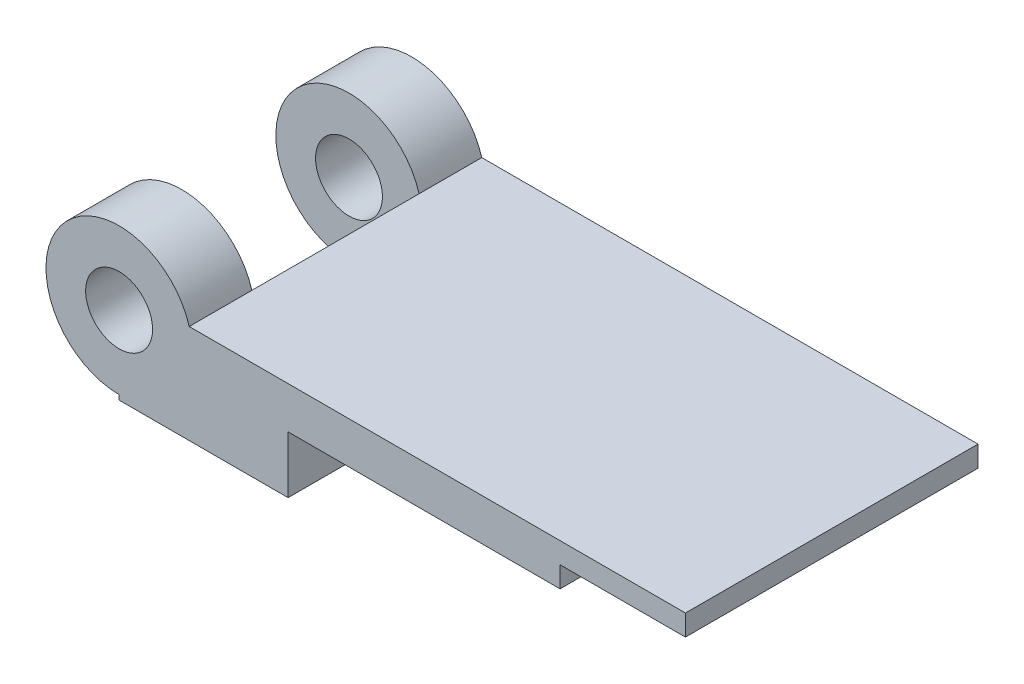
ISO-10303-21;
HEADER;
FILE_DESCRIPTION(('STEP AP214'),'2;1');
FILE_NAME('part.step','',(''),(''),'','','');
FILE_SCHEMA(('AUTOMOTIVE_DESIGN { 1 0 10303 214 1 1 1 1 }'));
ENDSEC;
DATA;
#1=APPLICATION_CONTEXT('core data for automotive mechanical design processes');
#2=APPLICATION_PROTOCOL_DEFINITION('international standard','automotive_design',2000,#1);
#3=PRODUCT_CONTEXT('',#1,'mechanical');
#4=PRODUCT('Part','Part','',(#3));
#5=PRODUCT_RELATED_PRODUCT_CATEGORY('part','',(#4));
#6=PRODUCT_DEFINITION_FORMATION('','',#4);
#7=PRODUCT_DEFINITION_CONTEXT('part definition',#1,'design');
#8=PRODUCT_DEFINITION('design','',#6,#7);
#9=PRODUCT_DEFINITION_SHAPE('','',#8);
#10=(LENGTH_UNIT() NAMED_UNIT(*) SI_UNIT(.MILLI.,.METRE.));
#11=(NAMED_UNIT(*) PLANE_ANGLE_UNIT() SI_UNIT($,.RADIAN.));
#12=(NAMED_UNIT(*) SI_UNIT($,.STERADIAN.) SOLID_ANGLE_UNIT());
#13=UNCERTAINTY_MEASURE_WITH_UNIT(LENGTH_MEASURE(1.E-05),#10,'distance_accuracy_value','');
#14=(GEOMETRIC_REPRESENTATION_CONTEXT(3) GLOBAL_UNCERTAINTY_ASSIGNED_CONTEXT((#13)) GLOBAL_UNIT_ASSIGNED_CONTEXT((#10,
#11,#12)) REPRESENTATION_CONTEXT('',''));
#15=CARTESIAN_POINT('',(0.,0.,0.));
#16=DIRECTION('',(0.,0.,1.));
#17=DIRECTION('',(1.,0.,0.));
#18=AXIS2_PLACEMENT_3D('',#15,#16,#17);
#19=CARTESIAN_POINT('',(0.,0.,3.));
#20=DIRECTION('',(0.,0.,1.));
#21=DIRECTION('',(1.,0.,0.));
#22=AXIS2_PLACEMENT_3D('',#19,#20,#21);
#23=CYLINDRICAL_SURFACE('',#22,3.5);
#24=CARTESIAN_POINT('',(0.,0.,11.));
#25=DIRECTION('',(0.,0.,1.));
#26=DIRECTION('',(1.,0.,0.));
#27=AXIS2_PLACEMENT_3D('',#24,#25,#26);
#28=CIRCLE('',#27,3.5);
#29=CARTESIAN_POINT('',(0.,-3.5,11.));
#30=VERTEX_POINT('',#29);
#31=CARTESIAN_POINT('',(1.01365674663567,-3.35,11.));
#32=VERTEX_POINT('',#31);
#33=EDGE_CURVE('E223',#30,#32,#28,.T.);
#34=ORIENTED_EDGE('',*,*,#33,.T.);
#35=DIRECTION('',(0.,0.,1.));
#36=VECTOR('',#35,1.);
#37=CARTESIAN_POINT('',(1.01365674663567,-3.35,3.));
#38=LINE('',#37,#36);
#39=CARTESIAN_POINT('',(1.01365674663567,-3.35,3.));
#40=VERTEX_POINT('',#39);
#41=EDGE_CURVE('E177',#32,#40,#38,.F.);
#42=ORIENTED_EDGE('',*,*,#41,.T.);
#43=CARTESIAN_POINT('',(0.,0.,3.));
#44=DIRECTION('',(0.,0.,1.));
#45=DIRECTION('',(1.,0.,0.));
#46=AXIS2_PLACEMENT_3D('',#43,#44,#45);
#47=CIRCLE('',#46,3.5);
#48=CARTESIAN_POINT('',(0.,-3.5,3.));
#49=VERTEX_POINT('',#48);
#50=EDGE_CURVE('E218',#49,#40,#47,.T.);
#51=ORIENTED_EDGE('',*,*,#50,.F.);
#52=DIRECTION('',(0.,0.,1.));
#53=VECTOR('',#52,1.);
#54=CARTESIAN_POINT('',(0.,-3.5,-8.53336630915363));
#55=LINE('',#54,#53);
#56=EDGE_CURVE('E208',#49,#30,#55,.T.);
#57=ORIENTED_EDGE('',*,*,#56,.T.);
#58=EDGE_LOOP('',(#34,#42,#51,#57));
#59=FACE_BOUND('',#58,.T.);
#60=ADVANCED_FACE('F39',(#59),#23,.F.);
#61=CARTESIAN_POINT('',(8.08554437461576,-2.1,-8.53336630915363));
#62=DIRECTION('',(1.,0.,0.));
#63=DIRECTION('',(0.,0.,-1.));
#64=AXIS2_PLACEMENT_3D('',#61,#62,#63);
#65=PLANE('',#64);
#66=DIRECTION('',(0.,-1.,0.));
#67=VECTOR('',#66,1.);
#68=CARTESIAN_POINT('',(8.08554437461576,-2.1,0.));
#69=LINE('',#68,#67);
#70=CARTESIAN_POINT('',(8.08554437461576,-1.,0.));
#71=VERTEX_POINT('',#70);
#72=CARTESIAN_POINT('',(8.08554437461576,-3.72806025085915,0.));
#73=VERTEX_POINT('',#72);
#74=EDGE_CURVE('E187',#71,#73,#69,.T.);
#75=ORIENTED_EDGE('',*,*,#74,.F.);
#76=DIRECTION('',(0.,0.,1.));
#77=VECTOR('',#76,1.);
#78=CARTESIAN_POINT('',(8.08554437461576,-1.,-8.53336630915363));
#79=LINE('',#78,#77);
#80=CARTESIAN_POINT('',(8.08554437461576,-1.,14.));
#81=VERTEX_POINT('',#80);
#82=EDGE_CURVE('E185',#71,#81,#79,.T.);
#83=ORIENTED_EDGE('',*,*,#82,.T.);
#84=DIRECTION('',(0.,1.,0.));
#85=VECTOR('',#84,1.);
#86=CARTESIAN_POINT('',(8.08554437461576,-2.1,14.));
#87=LINE('',#86,#85);
#88=CARTESIAN_POINT('',(8.08554437461576,-3.72806025085915,14.));
#89=VERTEX_POINT('',#88);
#90=EDGE_CURVE('E195',#89,#81,#87,.T.);
#91=ORIENTED_EDGE('',*,*,#90,.F.);
#92=DIRECTION('',(0.,0.,1.));
#93=VECTOR('',#92,1.);
#94=CARTESIAN_POINT('',(8.08554437461576,-3.72806025085915,-8.53336630915363));
#95=LINE('',#94,#93);
#96=EDGE_CURVE('E201',#73,#89,#95,.T.);
#97=ORIENTED_EDGE('',*,*,#96,.F.);
#98=EDGE_LOOP('',(#75,#83,#91,#97));
#99=FACE_BOUND('',#98,.T.);
#100=DIRECTION('',(0.,0.,1.));
#101=VECTOR('',#100,1.);
#102=CARTESIAN_POINT('',(8.08554437461576,-3.35,-4.51758122903492));
#103=LINE('',#102,#101);
#104=CARTESIAN_POINT('',(8.08554437461576,-3.35,3.));
#105=VERTEX_POINT('',#104);
#106=CARTESIAN_POINT('',(8.08554437461576,-3.35,11.));
#107=VERTEX_POINT('',#106);
#108=EDGE_CURVE('E62',#105,#107,#103,.T.);
#109=ORIENTED_EDGE('',*,*,#108,.T.);
#110=DIRECTION('',(0.,1.,0.));
#111=VECTOR('',#110,1.);
#112=CARTESIAN_POINT('',(8.08554437461576,-2.15,11.));
#113=LINE('',#112,#111);
#114=CARTESIAN_POINT('',(8.08554437461576,-2.15,11.));
#115=VERTEX_POINT('',#114);
#116=EDGE_CURVE('E161',#107,#115,#113,.T.);
#117=ORIENTED_EDGE('',*,*,#116,.T.);
#118=DIRECTION('',(0.,0.,1.));
#119=VECTOR('',#118,1.);
#120=CARTESIAN_POINT('',(8.08554437461576,-2.15,-4.51758122903492));
#121=LINE('',#120,#119);
#122=CARTESIAN_POINT('',(8.08554437461576,-2.15,3.));
#123=VERTEX_POINT('',#122);
#124=EDGE_CURVE('E145',#123,#115,#121,.T.);
#125=ORIENTED_EDGE('',*,*,#124,.F.);
#126=DIRECTION('',(0.,-1.,0.));
#127=VECTOR('',#126,1.);
#128=CARTESIAN_POINT('',(8.08554437461576,-2.15,3.));
#129=LINE('',#128,#127);
#130=EDGE_CURVE('E168',#123,#105,#129,.T.);
#131=ORIENTED_EDGE('',*,*,#130,.T.);
#132=EDGE_LOOP('',(#109,#117,#125,#131));
#133=FACE_BOUND('',#132,.T.);
#134=ADVANCED_FACE('F165',(#99,#133),#65,.T.);
#135=CARTESIAN_POINT('',(0.,0.,14.));
#136=DIRECTION('',(0.,0.,-1.));
#137=DIRECTION('',(-1.,0.,0.));
#138=AXIS2_PLACEMENT_3D('',#135,#136,#137);
#139=CYLINDRICAL_SURFACE('',#138,3.5);
#140=CARTESIAN_POINT('',(0.,0.,0.));
#141=DIRECTION('',(0.,0.,1.));
#142=DIRECTION('',(1.,0.,0.));
#143=AXIS2_PLACEMENT_3D('',#140,#141,#142);
#144=CIRCLE('',#143,3.5);
#145=CARTESIAN_POINT('',(3.35410196624968,1.,0.));
#146=VERTEX_POINT('',#145);
#147=CARTESIAN_POINT('',(0.,-3.5,0.));
#148=VERTEX_POINT('',#147);
#149=EDGE_CURVE('E246',#146,#148,#144,.T.);
#150=ORIENTED_EDGE('',*,*,#149,.T.);
#151=EDGE_CURVE('E205',#148,#49,#55,.T.);
#152=ORIENTED_EDGE('',*,*,#151,.T.);
#153=CARTESIAN_POINT('',(3.35410196624968,1.,3.));
#154=VERTEX_POINT('',#153);
#155=EDGE_CURVE('E214',#154,#49,#47,.T.);
#156=ORIENTED_EDGE('',*,*,#155,.F.);
#157=DIRECTION('',(0.,0.,-1.));
#158=VECTOR('',#157,1.);
#159=CARTESIAN_POINT('',(3.35410196624968,1.,14.));
#160=LINE('',#159,#158);
#161=EDGE_CURVE('E259',#154,#146,#160,.T.);
#162=ORIENTED_EDGE('',*,*,#161,.T.);
#163=EDGE_LOOP('',(#150,#152,#156,#162));
#164=FACE_BOUND('',#163,.T.);
#165=ADVANCED_FACE('F275',(#164),#139,.T.);
#166=CARTESIAN_POINT('',(0.,0.,14.));
#167=DIRECTION('',(0.,0.,-1.));
#168=DIRECTION('',(-1.,0.,0.));
#169=AXIS2_PLACEMENT_3D('',#166,#167,#168);
#170=CYLINDRICAL_SURFACE('',#169,1.6);
#171=CARTESIAN_POINT('',(0.,0.,0.));
#172=DIRECTION('',(0.,0.,1.));
#173=DIRECTION('',(1.,0.,0.));
#174=AXIS2_PLACEMENT_3D('',#171,#172,#173);
#175=CIRCLE('',#174,1.6);
#176=CARTESIAN_POINT('',(1.6,0.,0.));
#177=VERTEX_POINT('',#176);
#178=EDGE_CURVE('E239',#177,#177,#175,.T.);
#179=ORIENTED_EDGE('',*,*,#178,.F.);
#180=EDGE_LOOP('',(#179));
#181=FACE_BOUND('',#180,.T.);
#182=CARTESIAN_POINT('',(0.,0.,3.));
#183=DIRECTION('',(0.,0.,1.));
#184=DIRECTION('',(1.,0.,0.));
#185=AXIS2_PLACEMENT_3D('',#182,#183,#184);
#186=CIRCLE('',#185,1.6);
#187=CARTESIAN_POINT('',(1.6,0.,3.));
#188=VERTEX_POINT('',#187);
#189=EDGE_CURVE('E209',#188,#188,#186,.T.);
#190=ORIENTED_EDGE('',*,*,#189,.T.);
#191=EDGE_LOOP('',(#190));
#192=FACE_BOUND('',#191,.T.);
#193=ADVANCED_FACE('F419',(#181,#192),#170,.F.);
#194=CARTESIAN_POINT('',(0.,0.,14.));
#195=DIRECTION('',(0.,0.,1.));
#196=DIRECTION('',(1.,0.,0.));
#197=AXIS2_PLACEMENT_3D('',#194,#195,#196);
#198=PLANE('',#197);
#199=CARTESIAN_POINT('',(0.,0.,14.));
#200=DIRECTION('',(0.,0.,1.));
#201=DIRECTION('',(1.,0.,0.));
#202=AXIS2_PLACEMENT_3D('',#199,#200,#201);
#203=CIRCLE('',#202,3.5);
#204=CARTESIAN_POINT('',(3.35410196624968,1.,14.));
#205=VERTEX_POINT('',#204);
#206=CARTESIAN_POINT('',(0.,-3.5,14.));
#207=VERTEX_POINT('',#206);
#208=EDGE_CURVE('E249',#205,#207,#203,.T.);
#209=ORIENTED_EDGE('',*,*,#208,.T.);
#210=DIRECTION('',(-1.60749424416334E-13,-1.,0.));
#211=VECTOR('',#210,1.);
#212=CARTESIAN_POINT('',(0.,-3.5,14.));
#213=LINE('',#212,#211);
#214=CARTESIAN_POINT('',(0.,-3.72806025085915,14.));
#215=VERTEX_POINT('',#214);
#216=EDGE_CURVE('E180',#207,#215,#213,.T.);
#217=ORIENTED_EDGE('',*,*,#216,.T.);
#218=DIRECTION('',(1.,0.,0.));
#219=VECTOR('',#218,1.);
#220=CARTESIAN_POINT('',(0.,-3.72806025085915,14.));
#221=LINE('',#220,#219);
#222=EDGE_CURVE('E192',#215,#89,#221,.T.);
#223=ORIENTED_EDGE('',*,*,#222,.T.);
#224=ORIENTED_EDGE('',*,*,#90,.T.);
#225=DIRECTION('',(1.,0.,0.));
#226=VECTOR('',#225,1.);
#227=CARTESIAN_POINT('',(3.35410196624968,-1.,14.));
#228=LINE('',#227,#226);
#229=CARTESIAN_POINT('',(21.1,-1.,14.));
#230=VERTEX_POINT('',#229);
#231=EDGE_CURVE('E252',#81,#230,#228,.T.);
#232=ORIENTED_EDGE('',*,*,#231,.T.);
#233=DIRECTION('',(0.,-1.,0.));
#234=VECTOR('',#233,1.);
#235=CARTESIAN_POINT('',(21.1,0.,14.));
#236=LINE('',#235,#234);
#237=CARTESIAN_POINT('',(21.1,0.,14.));
#238=VERTEX_POINT('',#237);
#239=EDGE_CURVE('E228',#238,#230,#236,.T.);
#240=ORIENTED_EDGE('',*,*,#239,.F.);
#241=DIRECTION('',(-1.,0.,0.));
#242=VECTOR('',#241,1.);
#243=CARTESIAN_POINT('',(27.1,0.,14.));
#244=LINE('',#243,#242);
#245=CARTESIAN_POINT('',(27.1,0.,14.));
#246=VERTEX_POINT('',#245);
#247=EDGE_CURVE('E217',#246,#238,#244,.T.);
#248=ORIENTED_EDGE('',*,*,#247,.F.);
#249=DIRECTION('',(0.,1.,0.));
#250=VECTOR('',#249,1.);
#251=CARTESIAN_POINT('',(27.1,1.,14.));
#252=LINE('',#251,#250);
#253=CARTESIAN_POINT('',(27.1,1.,14.));
#254=VERTEX_POINT('',#253);
#255=EDGE_CURVE('E255',#246,#254,#252,.T.);
#256=ORIENTED_EDGE('',*,*,#255,.T.);
#257=DIRECTION('',(-1.,0.,0.));
#258=VECTOR('',#257,1.);
#259=CARTESIAN_POINT('',(3.35410196624968,1.,14.));
#260=LINE('',#259,#258);
#261=EDGE_CURVE('E257',#254,#205,#260,.T.);
#262=ORIENTED_EDGE('',*,*,#261,.T.);
#263=EDGE_LOOP('',(#209,#217,#223,#224,#232,#240,#248,#256,#262));
#264=FACE_BOUND('',#263,.T.);
#265=CARTESIAN_POINT('',(0.,0.,14.));
#266=DIRECTION('',(0.,0.,1.));
#267=DIRECTION('',(1.,0.,0.));
#268=AXIS2_PLACEMENT_3D('',#265,#266,#267);
#269=CIRCLE('',#268,1.6);
#270=CARTESIAN_POINT('',(1.6,0.,14.));
#271=VERTEX_POINT('',#270);
#272=EDGE_CURVE('E243',#271,#271,#269,.T.);
#273=ORIENTED_EDGE('',*,*,#272,.F.);
#274=EDGE_LOOP('',(#273));
#275=FACE_BOUND('',#274,.T.);
#276=ADVANCED_FACE('F304',(#264,#275),#198,.T.);
#277=CARTESIAN_POINT('',(0.,0.,0.));
#278=DIRECTION('',(0.,0.,1.));
#279=DIRECTION('',(1.,0.,0.));
#280=AXIS2_PLACEMENT_3D('',#277,#278,#279);
#281=PLANE('',#280);
#282=DIRECTION('',(-1.,0.,0.));
#283=VECTOR('',#282,1.);
#284=CARTESIAN_POINT('',(27.1,0.,0.));
#285=LINE('',#284,#283);
#286=CARTESIAN_POINT('',(27.1,0.,0.));
#287=VERTEX_POINT('',#286);
#288=CARTESIAN_POINT('',(21.1,0.,0.));
#289=VERTEX_POINT('',#288);
#290=EDGE_CURVE('E224',#287,#289,#285,.T.);
#291=ORIENTED_EDGE('',*,*,#290,.T.);
#292=DIRECTION('',(0.,-1.,0.));
#293=VECTOR('',#292,1.);
#294=CARTESIAN_POINT('',(21.1,0.,0.));
#295=LINE('',#294,#293);
#296=CARTESIAN_POINT('',(21.1,-1.,0.));
#297=VERTEX_POINT('',#296);
#298=EDGE_CURVE('E227',#289,#297,#295,.T.);
#299=ORIENTED_EDGE('',*,*,#298,.T.);
#300=DIRECTION('',(1.,0.,0.));
#301=VECTOR('',#300,1.);
#302=CARTESIAN_POINT('',(3.35410196624968,-1.,0.));
#303=LINE('',#302,#301);
#304=EDGE_CURVE('E261',#71,#297,#303,.T.);
#305=ORIENTED_EDGE('',*,*,#304,.F.);
#306=ORIENTED_EDGE('',*,*,#74,.T.);
#307=DIRECTION('',(-1.,0.,0.));
#308=VECTOR('',#307,1.);
#309=CARTESIAN_POINT('',(0.,-3.72806025085915,0.));
#310=LINE('',#309,#308);
#311=CARTESIAN_POINT('',(0.,-3.72806025085915,0.));
#312=VERTEX_POINT('',#311);
#313=EDGE_CURVE('E184',#73,#312,#310,.T.);
#314=ORIENTED_EDGE('',*,*,#313,.T.);
#315=DIRECTION('',(1.60749424416334E-13,1.,0.));
#316=VECTOR('',#315,1.);
#317=CARTESIAN_POINT('',(0.,-3.5,0.));
#318=LINE('',#317,#316);
#319=EDGE_CURVE('E181',#312,#148,#318,.T.);
#320=ORIENTED_EDGE('',*,*,#319,.T.);
#321=ORIENTED_EDGE('',*,*,#149,.F.);
#322=DIRECTION('',(-1.,0.,0.));
#323=VECTOR('',#322,1.);
#324=CARTESIAN_POINT('',(3.35410196624968,1.,0.));
#325=LINE('',#324,#323);
#326=CARTESIAN_POINT('',(27.1,1.,0.));
#327=VERTEX_POINT('',#326);
#328=EDGE_CURVE('E253',#327,#146,#325,.T.);
#329=ORIENTED_EDGE('',*,*,#328,.F.);
#330=DIRECTION('',(0.,1.,0.));
#331=VECTOR('',#330,1.);
#332=CARTESIAN_POINT('',(27.1,1.,0.));
#333=LINE('',#332,#331);
#334=EDGE_CURVE('E263',#287,#327,#333,.T.);
#335=ORIENTED_EDGE('',*,*,#334,.F.);
#336=EDGE_LOOP('',(#291,#299,#305,#306,#314,#320,#321,#329,#335));
#337=FACE_BOUND('',#336,.T.);
#338=ORIENTED_EDGE('',*,*,#178,.T.);
#339=EDGE_LOOP('',(#338));
#340=FACE_BOUND('',#339,.T.);
#341=ADVANCED_FACE('F285',(#337,#340),#281,.F.);
#342=CARTESIAN_POINT('',(3.35410196624968,1.,11.));
#343=VERTEX_POINT('',#342);
#344=EDGE_CURVE('E220',#343,#30,#28,.T.);
#345=ORIENTED_EDGE('',*,*,#344,.T.);
#346=EDGE_CURVE('E198',#30,#207,#55,.T.);
#347=ORIENTED_EDGE('',*,*,#346,.T.);
#348=ORIENTED_EDGE('',*,*,#208,.F.);
#349=EDGE_CURVE('E47',#205,#343,#160,.T.);
#350=ORIENTED_EDGE('',*,*,#349,.T.);
#351=EDGE_LOOP('',(#345,#347,#348,#350));
#352=FACE_BOUND('',#351,.T.);
#353=ADVANCED_FACE('F41',(#352),#139,.T.);
#354=CARTESIAN_POINT('',(3.35410196624968,-1.,14.));
#355=DIRECTION('',(0.,1.,0.));
#356=DIRECTION('',(0.,0.,1.));
#357=AXIS2_PLACEMENT_3D('',#354,#355,#356);
#358=PLANE('',#357);
#359=ORIENTED_EDGE('',*,*,#231,.F.);
#360=ORIENTED_EDGE('',*,*,#82,.F.);
#361=ORIENTED_EDGE('',*,*,#304,.T.);
#362=DIRECTION('',(0.,0.,1.));
#363=VECTOR('',#362,1.);
#364=CARTESIAN_POINT('',(21.1,-1.,0.));
#365=LINE('',#364,#363);
#366=EDGE_CURVE('E236',#297,#230,#365,.T.);
#367=ORIENTED_EDGE('',*,*,#366,.T.);
#368=EDGE_LOOP('',(#359,#360,#361,#367));
#369=FACE_BOUND('',#368,.T.);
#370=ADVANCED_FACE('F316',(#369),#358,.F.);
#371=CARTESIAN_POINT('',(27.1,1.,14.));
#372=DIRECTION('',(-1.,0.,0.));
#373=DIRECTION('',(0.,0.,1.));
#374=AXIS2_PLACEMENT_3D('',#371,#372,#373);
#375=PLANE('',#374);
#376=ORIENTED_EDGE('',*,*,#255,.F.);
#377=DIRECTION('',(0.,0.,1.));
#378=VECTOR('',#377,1.);
#379=CARTESIAN_POINT('',(27.1,0.,0.));
#380=LINE('',#379,#378);
#381=EDGE_CURVE('E231',#287,#246,#380,.T.);
#382=ORIENTED_EDGE('',*,*,#381,.F.);
#383=ORIENTED_EDGE('',*,*,#334,.T.);
#384=DIRECTION('',(0.,0.,-1.));
#385=VECTOR('',#384,1.);
#386=CARTESIAN_POINT('',(27.1,1.,14.));
#387=LINE('',#386,#385);
#388=EDGE_CURVE('E11',#254,#327,#387,.T.);
#389=ORIENTED_EDGE('',*,*,#388,.F.);
#390=EDGE_LOOP('',(#376,#382,#383,#389));
#391=FACE_BOUND('',#390,.T.);
#392=ADVANCED_FACE('F326',(#391),#375,.F.);
#393=CARTESIAN_POINT('',(3.35410196624968,1.,14.));
#394=DIRECTION('',(0.,-1.,0.));
#395=DIRECTION('',(0.,0.,-1.));
#396=AXIS2_PLACEMENT_3D('',#393,#394,#395);
#397=PLANE('',#396);
#398=ORIENTED_EDGE('',*,*,#328,.T.);
#399=ORIENTED_EDGE('',*,*,#161,.F.);
#400=EDGE_CURVE('E267',#343,#154,#160,.T.);
#401=ORIENTED_EDGE('',*,*,#400,.F.);
#402=ORIENTED_EDGE('',*,*,#349,.F.);
#403=ORIENTED_EDGE('',*,*,#261,.F.);
#404=ORIENTED_EDGE('',*,*,#388,.T.);
#405=EDGE_LOOP('',(#398,#399,#401,#402,#403,#404));
#406=FACE_BOUND('',#405,.T.);
#407=ADVANCED_FACE('F280',(#406),#397,.F.);
#408=CARTESIAN_POINT('',(0.,0.,11.));
#409=DIRECTION('',(0.,0.,1.));
#410=DIRECTION('',(1.,0.,0.));
#411=AXIS2_PLACEMENT_3D('',#408,#409,#410);
#412=CIRCLE('',#411,1.6);
#413=CARTESIAN_POINT('',(1.6,0.,11.));
#414=VERTEX_POINT('',#413);
#415=EDGE_CURVE('E189',#414,#414,#412,.T.);
#416=ORIENTED_EDGE('',*,*,#415,.F.);
#417=EDGE_LOOP('',(#416));
#418=FACE_BOUND('',#417,.T.);
#419=ORIENTED_EDGE('',*,*,#272,.T.);
#420=EDGE_LOOP('',(#419));
#421=FACE_BOUND('',#420,.T.);
#422=ADVANCED_FACE('F336',(#418,#421),#170,.F.);
#423=CARTESIAN_POINT('',(21.1,0.,0.));
#424=DIRECTION('',(-1.,0.,0.));
#425=DIRECTION('',(0.,0.,1.));
#426=AXIS2_PLACEMENT_3D('',#423,#424,#425);
#427=PLANE('',#426);
#428=ORIENTED_EDGE('',*,*,#239,.T.);
#429=ORIENTED_EDGE('',*,*,#366,.F.);
#430=ORIENTED_EDGE('',*,*,#298,.F.);
#431=DIRECTION('',(0.,0.,1.));
#432=VECTOR('',#431,1.);
#433=CARTESIAN_POINT('',(21.1,0.,0.));
#434=LINE('',#433,#432);
#435=EDGE_CURVE('E240',#289,#238,#434,.T.);
#436=ORIENTED_EDGE('',*,*,#435,.T.);
#437=EDGE_LOOP('',(#428,#429,#430,#436));
#438=FACE_BOUND('',#437,.T.);
#439=ADVANCED_FACE('F320',(#438),#427,.F.);
#440=CARTESIAN_POINT('',(27.1,0.,0.));
#441=DIRECTION('',(0.,1.,0.));
#442=DIRECTION('',(-1.,0.,0.));
#443=AXIS2_PLACEMENT_3D('',#440,#441,#442);
#444=PLANE('',#443);
#445=ORIENTED_EDGE('',*,*,#247,.T.);
#446=ORIENTED_EDGE('',*,*,#435,.F.);
#447=ORIENTED_EDGE('',*,*,#290,.F.);
#448=ORIENTED_EDGE('',*,*,#381,.T.);
#449=EDGE_LOOP('',(#445,#446,#447,#448));
#450=FACE_BOUND('',#449,.T.);
#451=ADVANCED_FACE('F327',(#450),#444,.F.);
#452=CARTESIAN_POINT('',(2.7617928959283,-2.15,3.));
#453=VERTEX_POINT('',#452);
#454=EDGE_CURVE('E219',#453,#154,#47,.T.);
#455=ORIENTED_EDGE('',*,*,#454,.F.);
#456=DIRECTION('',(0.,0.,1.));
#457=VECTOR('',#456,1.);
#458=CARTESIAN_POINT('',(2.7617928959283,-2.15,3.));
#459=LINE('',#458,#457);
#460=CARTESIAN_POINT('',(2.7617928959283,-2.15,11.));
#461=VERTEX_POINT('',#460);
#462=EDGE_CURVE('E175',#453,#461,#459,.T.);
#463=ORIENTED_EDGE('',*,*,#462,.T.);
#464=EDGE_CURVE('E163',#461,#343,#28,.T.);
#465=ORIENTED_EDGE('',*,*,#464,.T.);
#466=ORIENTED_EDGE('',*,*,#400,.T.);
#467=EDGE_LOOP('',(#455,#463,#465,#466));
#468=FACE_BOUND('',#467,.T.);
#469=ADVANCED_FACE('F301',(#468),#23,.F.);
#470=CARTESIAN_POINT('',(0.,0.,3.));
#471=DIRECTION('',(0.,0.,1.));
#472=DIRECTION('',(1.,0.,0.));
#473=AXIS2_PLACEMENT_3D('',#470,#471,#472);
#474=PLANE('',#473);
#475=ORIENTED_EDGE('',*,*,#50,.T.);
#476=DIRECTION('',(-1.,0.,0.));
#477=VECTOR('',#476,1.);
#478=CARTESIAN_POINT('',(8.08554437461576,-3.35,3.));
#479=LINE('',#478,#477);
#480=EDGE_CURVE('E172',#105,#40,#479,.T.);
#481=ORIENTED_EDGE('',*,*,#480,.F.);
#482=ORIENTED_EDGE('',*,*,#130,.F.);
#483=DIRECTION('',(1.,0.,0.));
#484=VECTOR('',#483,1.);
#485=CARTESIAN_POINT('',(0.664356630383832,-2.15,3.));
#486=LINE('',#485,#484);
#487=EDGE_CURVE('E54',#453,#123,#486,.T.);
#488=ORIENTED_EDGE('',*,*,#487,.F.);
#489=ORIENTED_EDGE('',*,*,#454,.T.);
#490=ORIENTED_EDGE('',*,*,#155,.T.);
#491=EDGE_LOOP('',(#475,#481,#482,#488,#489,#490));
#492=FACE_BOUND('',#491,.T.);
#493=ORIENTED_EDGE('',*,*,#189,.F.);
#494=EDGE_LOOP('',(#493));
#495=FACE_BOUND('',#494,.T.);
#496=ADVANCED_FACE('F297',(#492,#495),#474,.T.);
#497=CARTESIAN_POINT('',(0.,0.,11.));
#498=DIRECTION('',(0.,0.,1.));
#499=DIRECTION('',(1.,0.,0.));
#500=AXIS2_PLACEMENT_3D('',#497,#498,#499);
#501=PLANE('',#500);
#502=ORIENTED_EDGE('',*,*,#464,.F.);
#503=DIRECTION('',(-1.,0.,0.));
#504=VECTOR('',#503,1.);
#505=CARTESIAN_POINT('',(0.664356630383832,-2.15,11.));
#506=LINE('',#505,#504);
#507=EDGE_CURVE('E148',#115,#461,#506,.T.);
#508=ORIENTED_EDGE('',*,*,#507,.F.);
#509=ORIENTED_EDGE('',*,*,#116,.F.);
#510=DIRECTION('',(1.,0.,0.));
#511=VECTOR('',#510,1.);
#512=CARTESIAN_POINT('',(8.08554437461576,-3.35,11.));
#513=LINE('',#512,#511);
#514=EDGE_CURVE('E153',#32,#107,#513,.T.);
#515=ORIENTED_EDGE('',*,*,#514,.F.);
#516=ORIENTED_EDGE('',*,*,#33,.F.);
#517=ORIENTED_EDGE('',*,*,#344,.F.);
#518=EDGE_LOOP('',(#502,#508,#509,#515,#516,#517));
#519=FACE_BOUND('',#518,.T.);
#520=ORIENTED_EDGE('',*,*,#415,.T.);
#521=EDGE_LOOP('',(#520));
#522=FACE_BOUND('',#521,.T.);
#523=ADVANCED_FACE('F158',(#519,#522),#501,.F.);
#524=CARTESIAN_POINT('',(0.,-3.72806025085915,-8.53336630915363));
#525=DIRECTION('',(0.,-1.,0.));
#526=DIRECTION('',(0.,0.,-1.));
#527=AXIS2_PLACEMENT_3D('',#524,#525,#526);
#528=PLANE('',#527);
#529=ORIENTED_EDGE('',*,*,#313,.F.);
#530=ORIENTED_EDGE('',*,*,#96,.T.);
#531=ORIENTED_EDGE('',*,*,#222,.F.);
#532=DIRECTION('',(0.,0.,1.));
#533=VECTOR('',#532,1.);
#534=CARTESIAN_POINT('',(0.,-3.72806025085915,-8.53336630915363));
#535=LINE('',#534,#533);
#536=EDGE_CURVE('E203',#312,#215,#535,.T.);
#537=ORIENTED_EDGE('',*,*,#536,.F.);
#538=EDGE_LOOP('',(#529,#530,#531,#537));
#539=FACE_BOUND('',#538,.T.);
#540=ADVANCED_FACE('F308',(#539),#528,.T.);
#541=CARTESIAN_POINT('',(0.,-3.5,-8.53336630915363));
#542=DIRECTION('',(-1.,1.60749424416334E-13,0.));
#543=DIRECTION('',(-1.60749424416334E-13,-1.,0.));
#544=AXIS2_PLACEMENT_3D('',#541,#542,#543);
#545=PLANE('',#544);
#546=ORIENTED_EDGE('',*,*,#319,.F.);
#547=ORIENTED_EDGE('',*,*,#536,.T.);
#548=ORIENTED_EDGE('',*,*,#216,.F.);
#549=ORIENTED_EDGE('',*,*,#346,.F.);
#550=ORIENTED_EDGE('',*,*,#56,.F.);
#551=ORIENTED_EDGE('',*,*,#151,.F.);
#552=EDGE_LOOP('',(#546,#547,#548,#549,#550,#551));
#553=FACE_BOUND('',#552,.T.);
#554=ADVANCED_FACE('F293',(#553),#545,.T.);
#555=CARTESIAN_POINT('',(8.08554437461576,-3.35,-4.51758122903492));
#556=DIRECTION('',(0.,-1.,0.));
#557=DIRECTION('',(0.,0.,-1.));
#558=AXIS2_PLACEMENT_3D('',#555,#556,#557);
#559=PLANE('',#558);
#560=ORIENTED_EDGE('',*,*,#514,.T.);
#561=ORIENTED_EDGE('',*,*,#108,.F.);
#562=ORIENTED_EDGE('',*,*,#480,.T.);
#563=ORIENTED_EDGE('',*,*,#41,.F.);
#564=EDGE_LOOP('',(#560,#561,#562,#563));
#565=FACE_BOUND('',#564,.T.);
#566=ADVANCED_FACE('F353',(#565),#559,.F.);
#567=CARTESIAN_POINT('',(0.664356630383832,-2.15,-4.51758122903492));
#568=DIRECTION('',(0.,1.,0.));
#569=DIRECTION('',(0.,0.,1.));
#570=AXIS2_PLACEMENT_3D('',#567,#568,#569);
#571=PLANE('',#570);
#572=ORIENTED_EDGE('',*,*,#487,.T.);
#573=ORIENTED_EDGE('',*,*,#124,.T.);
#574=ORIENTED_EDGE('',*,*,#507,.T.);
#575=ORIENTED_EDGE('',*,*,#462,.F.);
#576=EDGE_LOOP('',(#572,#573,#574,#575));
#577=FACE_BOUND('',#576,.T.);
#578=ADVANCED_FACE('F147',(#577),#571,.F.);
#579=CLOSED_SHELL('',(#60,#134,#165,#193,#276,#341,#353,#370,#392,#407,#422,#439,#451,#469,#496,
#523,#540,#554,#566,#578));
#580=MANIFOLD_SOLID_BREP('B2',#579);
#581=ADVANCED_BREP_SHAPE_REPRESENTATION('',(#18,#580),#14);
#582=SHAPE_DEFINITION_REPRESENTATION(#9,#581);
ENDSEC;
END-ISO-10303-21;
